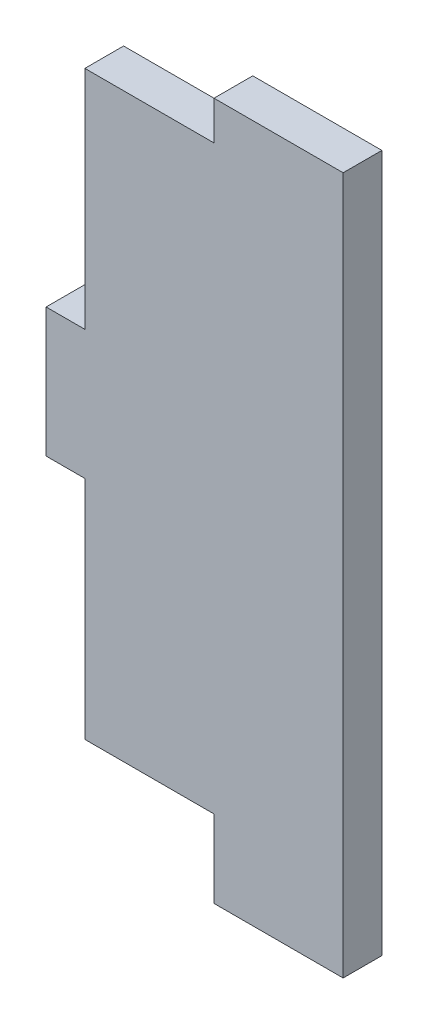
ISO-10303-21;
HEADER;
FILE_DESCRIPTION(('STEP AP214'),'2;1');
FILE_NAME('part.step','',(''),(''),'','','');
FILE_SCHEMA(('AUTOMOTIVE_DESIGN { 1 0 10303 214 1 1 1 1 }'));
ENDSEC;
DATA;
#1=APPLICATION_CONTEXT('core data for automotive mechanical design processes');
#2=APPLICATION_PROTOCOL_DEFINITION('international standard','automotive_design',2000,#1);
#3=PRODUCT_CONTEXT('',#1,'mechanical');
#4=PRODUCT('Part','Part','',(#3));
#5=PRODUCT_RELATED_PRODUCT_CATEGORY('part','',(#4));
#6=PRODUCT_DEFINITION_FORMATION('','',#4);
#7=PRODUCT_DEFINITION_CONTEXT('part definition',#1,'design');
#8=PRODUCT_DEFINITION('design','',#6,#7);
#9=PRODUCT_DEFINITION_SHAPE('','',#8);
#10=(LENGTH_UNIT() NAMED_UNIT(*) SI_UNIT(.MILLI.,.METRE.));
#11=(NAMED_UNIT(*) PLANE_ANGLE_UNIT() SI_UNIT($,.RADIAN.));
#12=(NAMED_UNIT(*) SI_UNIT($,.STERADIAN.) SOLID_ANGLE_UNIT());
#13=UNCERTAINTY_MEASURE_WITH_UNIT(LENGTH_MEASURE(1.E-05),#10,'distance_accuracy_value','');
#14=(GEOMETRIC_REPRESENTATION_CONTEXT(3) GLOBAL_UNCERTAINTY_ASSIGNED_CONTEXT((#13)) GLOBAL_UNIT_ASSIGNED_CONTEXT((#10,
#11,#12)) REPRESENTATION_CONTEXT('',''));
#15=CARTESIAN_POINT('',(0.,0.,0.));
#16=DIRECTION('',(0.,0.,1.));
#17=DIRECTION('',(1.,0.,0.));
#18=AXIS2_PLACEMENT_3D('',#15,#16,#17);
#19=CARTESIAN_POINT('',(0.,17.5,3.));
#20=DIRECTION('',(1.,0.,0.));
#21=DIRECTION('',(0.,0.,-1.));
#22=AXIS2_PLACEMENT_3D('',#19,#20,#21);
#23=PLANE('',#22);
#24=DIRECTION('',(0.,-1.,0.));
#25=VECTOR('',#24,1.);
#26=CARTESIAN_POINT('',(0.,17.5,0.));
#27=LINE('',#26,#25);
#28=CARTESIAN_POINT('',(0.,17.5,0.));
#29=VERTEX_POINT('',#28);
#30=CARTESIAN_POINT('',(0.,0.,0.));
#31=VERTEX_POINT('',#30);
#32=EDGE_CURVE('E153',#29,#31,#27,.T.);
#33=ORIENTED_EDGE('',*,*,#32,.T.);
#34=DIRECTION('',(0.,0.,-1.));
#35=VECTOR('',#34,1.);
#36=CARTESIAN_POINT('',(0.,0.,3.));
#37=LINE('',#36,#35);
#38=CARTESIAN_POINT('',(0.,0.,3.));
#39=VERTEX_POINT('',#38);
#40=EDGE_CURVE('E11',#39,#31,#37,.T.);
#41=ORIENTED_EDGE('',*,*,#40,.F.);
#42=DIRECTION('',(0.,-1.,0.));
#43=VECTOR('',#42,1.);
#44=CARTESIAN_POINT('',(0.,17.5,3.));
#45=LINE('',#44,#43);
#46=CARTESIAN_POINT('',(0.,17.5,3.));
#47=VERTEX_POINT('',#46);
#48=EDGE_CURVE('E175',#47,#39,#45,.T.);
#49=ORIENTED_EDGE('',*,*,#48,.F.);
#50=DIRECTION('',(0.,0.,-1.));
#51=VECTOR('',#50,1.);
#52=CARTESIAN_POINT('',(0.,17.5,3.));
#53=LINE('',#52,#51);
#54=EDGE_CURVE('E149',#47,#29,#53,.T.);
#55=ORIENTED_EDGE('',*,*,#54,.T.);
#56=EDGE_LOOP('',(#33,#41,#49,#55));
#57=FACE_BOUND('',#56,.T.);
#58=ADVANCED_FACE('F33',(#57),#23,.F.);
#59=CARTESIAN_POINT('',(0.,0.,3.));
#60=DIRECTION('',(0.,1.,0.));
#61=DIRECTION('',(0.,0.,1.));
#62=AXIS2_PLACEMENT_3D('',#59,#60,#61);
#63=PLANE('',#62);
#64=DIRECTION('',(1.,0.,0.));
#65=VECTOR('',#64,1.);
#66=CARTESIAN_POINT('',(0.,0.,0.));
#67=LINE('',#66,#65);
#68=CARTESIAN_POINT('',(10.,0.,0.));
#69=VERTEX_POINT('',#68);
#70=EDGE_CURVE('E156',#31,#69,#67,.T.);
#71=ORIENTED_EDGE('',*,*,#70,.T.);
#72=DIRECTION('',(0.,0.,-1.));
#73=VECTOR('',#72,1.);
#74=CARTESIAN_POINT('',(10.,0.,3.));
#75=LINE('',#74,#73);
#76=CARTESIAN_POINT('',(10.,0.,3.));
#77=VERTEX_POINT('',#76);
#78=EDGE_CURVE('E41',#77,#69,#75,.T.);
#79=ORIENTED_EDGE('',*,*,#78,.F.);
#80=DIRECTION('',(1.,0.,0.));
#81=VECTOR('',#80,1.);
#82=CARTESIAN_POINT('',(0.,0.,3.));
#83=LINE('',#82,#81);
#84=EDGE_CURVE('E104',#39,#77,#83,.T.);
#85=ORIENTED_EDGE('',*,*,#84,.F.);
#86=ORIENTED_EDGE('',*,*,#40,.T.);
#87=EDGE_LOOP('',(#71,#79,#85,#86));
#88=FACE_BOUND('',#87,.T.);
#89=ADVANCED_FACE('F253',(#88),#63,.F.);
#90=CARTESIAN_POINT('',(10.,0.,3.));
#91=DIRECTION('',(1.,0.,0.));
#92=DIRECTION('',(0.,1.,0.));
#93=AXIS2_PLACEMENT_3D('',#90,#91,#92);
#94=PLANE('',#93);
#95=DIRECTION('',(0.,-1.,0.));
#96=VECTOR('',#95,1.);
#97=CARTESIAN_POINT('',(10.,0.,0.));
#98=LINE('',#97,#96);
#99=CARTESIAN_POINT('',(10.,-6.,0.));
#100=VERTEX_POINT('',#99);
#101=EDGE_CURVE('E158',#69,#100,#98,.T.);
#102=ORIENTED_EDGE('',*,*,#101,.T.);
#103=DIRECTION('',(0.,0.,-1.));
#104=VECTOR('',#103,1.);
#105=CARTESIAN_POINT('',(10.,-6.,3.));
#106=LINE('',#105,#104);
#107=CARTESIAN_POINT('',(10.,-6.,3.));
#108=VERTEX_POINT('',#107);
#109=EDGE_CURVE('E194',#108,#100,#106,.T.);
#110=ORIENTED_EDGE('',*,*,#109,.F.);
#111=DIRECTION('',(0.,-1.,0.));
#112=VECTOR('',#111,1.);
#113=CARTESIAN_POINT('',(10.,0.,3.));
#114=LINE('',#113,#112);
#115=EDGE_CURVE('E202',#77,#108,#114,.T.);
#116=ORIENTED_EDGE('',*,*,#115,.F.);
#117=ORIENTED_EDGE('',*,*,#78,.T.);
#118=EDGE_LOOP('',(#102,#110,#116,#117));
#119=FACE_BOUND('',#118,.T.);
#120=ADVANCED_FACE('F200',(#119),#94,.F.);
#121=CARTESIAN_POINT('',(10.,-6.,3.));
#122=DIRECTION('',(0.,1.,0.));
#123=DIRECTION('',(0.,0.,1.));
#124=AXIS2_PLACEMENT_3D('',#121,#122,#123);
#125=PLANE('',#124);
#126=DIRECTION('',(1.,0.,0.));
#127=VECTOR('',#126,1.);
#128=CARTESIAN_POINT('',(10.,-6.,0.));
#129=LINE('',#128,#127);
#130=CARTESIAN_POINT('',(20.,-6.,0.));
#131=VERTEX_POINT('',#130);
#132=EDGE_CURVE('E160',#100,#131,#129,.T.);
#133=ORIENTED_EDGE('',*,*,#132,.T.);
#134=DIRECTION('',(0.,0.,-1.));
#135=VECTOR('',#134,1.);
#136=CARTESIAN_POINT('',(20.,-6.,3.));
#137=LINE('',#136,#135);
#138=CARTESIAN_POINT('',(20.,-6.,3.));
#139=VERTEX_POINT('',#138);
#140=EDGE_CURVE('E191',#139,#131,#137,.T.);
#141=ORIENTED_EDGE('',*,*,#140,.F.);
#142=DIRECTION('',(1.,0.,0.));
#143=VECTOR('',#142,1.);
#144=CARTESIAN_POINT('',(10.,-6.,3.));
#145=LINE('',#144,#143);
#146=EDGE_CURVE('E220',#108,#139,#145,.T.);
#147=ORIENTED_EDGE('',*,*,#146,.F.);
#148=ORIENTED_EDGE('',*,*,#109,.T.);
#149=EDGE_LOOP('',(#133,#141,#147,#148));
#150=FACE_BOUND('',#149,.T.);
#151=ADVANCED_FACE('F211',(#150),#125,.F.);
#152=CARTESIAN_POINT('',(20.,-6.,3.));
#153=DIRECTION('',(-1.,0.,0.));
#154=DIRECTION('',(0.,0.,1.));
#155=AXIS2_PLACEMENT_3D('',#152,#153,#154);
#156=PLANE('',#155);
#157=DIRECTION('',(0.,1.,0.));
#158=VECTOR('',#157,1.);
#159=CARTESIAN_POINT('',(20.,-6.,0.));
#160=LINE('',#159,#158);
#161=CARTESIAN_POINT('',(20.,48.,0.));
#162=VERTEX_POINT('',#161);
#163=EDGE_CURVE('E162',#131,#162,#160,.T.);
#164=ORIENTED_EDGE('',*,*,#163,.T.);
#165=DIRECTION('',(0.,0.,-1.));
#166=VECTOR('',#165,1.);
#167=CARTESIAN_POINT('',(20.,48.,3.));
#168=LINE('',#167,#166);
#169=CARTESIAN_POINT('',(20.,48.,3.));
#170=VERTEX_POINT('',#169);
#171=EDGE_CURVE('E188',#170,#162,#168,.T.);
#172=ORIENTED_EDGE('',*,*,#171,.F.);
#173=DIRECTION('',(0.,1.,0.));
#174=VECTOR('',#173,1.);
#175=CARTESIAN_POINT('',(20.,-6.,3.));
#176=LINE('',#175,#174);
#177=EDGE_CURVE('E217',#139,#170,#176,.T.);
#178=ORIENTED_EDGE('',*,*,#177,.F.);
#179=ORIENTED_EDGE('',*,*,#140,.T.);
#180=EDGE_LOOP('',(#164,#172,#178,#179));
#181=FACE_BOUND('',#180,.T.);
#182=ADVANCED_FACE('F215',(#181),#156,.F.);
#183=CARTESIAN_POINT('',(20.,48.,3.));
#184=DIRECTION('',(0.,-1.,0.));
#185=DIRECTION('',(1.,0.,0.));
#186=AXIS2_PLACEMENT_3D('',#183,#184,#185);
#187=PLANE('',#186);
#188=DIRECTION('',(-1.,0.,0.));
#189=VECTOR('',#188,1.);
#190=CARTESIAN_POINT('',(20.,48.,0.));
#191=LINE('',#190,#189);
#192=CARTESIAN_POINT('',(10.,48.,0.));
#193=VERTEX_POINT('',#192);
#194=EDGE_CURVE('E164',#162,#193,#191,.T.);
#195=ORIENTED_EDGE('',*,*,#194,.T.);
#196=DIRECTION('',(0.,0.,-1.));
#197=VECTOR('',#196,1.);
#198=CARTESIAN_POINT('',(10.,48.,3.));
#199=LINE('',#198,#197);
#200=CARTESIAN_POINT('',(10.,48.,3.));
#201=VERTEX_POINT('',#200);
#202=EDGE_CURVE('E185',#201,#193,#199,.T.);
#203=ORIENTED_EDGE('',*,*,#202,.F.);
#204=DIRECTION('',(-1.,0.,0.));
#205=VECTOR('',#204,1.);
#206=CARTESIAN_POINT('',(20.,48.,3.));
#207=LINE('',#206,#205);
#208=EDGE_CURVE('E219',#170,#201,#207,.T.);
#209=ORIENTED_EDGE('',*,*,#208,.F.);
#210=ORIENTED_EDGE('',*,*,#171,.T.);
#211=EDGE_LOOP('',(#195,#203,#209,#210));
#212=FACE_BOUND('',#211,.T.);
#213=ADVANCED_FACE('F266',(#212),#187,.F.);
#214=CARTESIAN_POINT('',(10.,48.,3.));
#215=DIRECTION('',(1.,0.,0.));
#216=DIRECTION('',(0.,0.,-1.));
#217=AXIS2_PLACEMENT_3D('',#214,#215,#216);
#218=PLANE('',#217);
#219=DIRECTION('',(0.,-1.,0.));
#220=VECTOR('',#219,1.);
#221=CARTESIAN_POINT('',(10.,48.,0.));
#222=LINE('',#221,#220);
#223=CARTESIAN_POINT('',(10.,45.,0.));
#224=VERTEX_POINT('',#223);
#225=EDGE_CURVE('E166',#193,#224,#222,.T.);
#226=ORIENTED_EDGE('',*,*,#225,.T.);
#227=DIRECTION('',(0.,0.,-1.));
#228=VECTOR('',#227,1.);
#229=CARTESIAN_POINT('',(10.,45.,3.));
#230=LINE('',#229,#228);
#231=CARTESIAN_POINT('',(10.,45.,3.));
#232=VERTEX_POINT('',#231);
#233=EDGE_CURVE('E182',#232,#224,#230,.T.);
#234=ORIENTED_EDGE('',*,*,#233,.F.);
#235=DIRECTION('',(0.,-1.,0.));
#236=VECTOR('',#235,1.);
#237=CARTESIAN_POINT('',(10.,48.,3.));
#238=LINE('',#237,#236);
#239=EDGE_CURVE('E222',#201,#232,#238,.T.);
#240=ORIENTED_EDGE('',*,*,#239,.F.);
#241=ORIENTED_EDGE('',*,*,#202,.T.);
#242=EDGE_LOOP('',(#226,#234,#240,#241));
#243=FACE_BOUND('',#242,.T.);
#244=ADVANCED_FACE('F269',(#243),#218,.F.);
#245=CARTESIAN_POINT('',(10.,45.,3.));
#246=DIRECTION('',(0.,-1.,0.));
#247=DIRECTION('',(0.,0.,-1.));
#248=AXIS2_PLACEMENT_3D('',#245,#246,#247);
#249=PLANE('',#248);
#250=DIRECTION('',(-1.,0.,0.));
#251=VECTOR('',#250,1.);
#252=CARTESIAN_POINT('',(10.,45.,0.));
#253=LINE('',#252,#251);
#254=CARTESIAN_POINT('',(0.,45.,0.));
#255=VERTEX_POINT('',#254);
#256=EDGE_CURVE('E168',#224,#255,#253,.T.);
#257=ORIENTED_EDGE('',*,*,#256,.T.);
#258=DIRECTION('',(0.,0.,-1.));
#259=VECTOR('',#258,1.);
#260=CARTESIAN_POINT('',(0.,45.,3.));
#261=LINE('',#260,#259);
#262=CARTESIAN_POINT('',(0.,45.,3.));
#263=VERTEX_POINT('',#262);
#264=EDGE_CURVE('E179',#263,#255,#261,.T.);
#265=ORIENTED_EDGE('',*,*,#264,.F.);
#266=DIRECTION('',(-1.,0.,0.));
#267=VECTOR('',#266,1.);
#268=CARTESIAN_POINT('',(10.,45.,3.));
#269=LINE('',#268,#267);
#270=EDGE_CURVE('E228',#232,#263,#269,.T.);
#271=ORIENTED_EDGE('',*,*,#270,.F.);
#272=ORIENTED_EDGE('',*,*,#233,.T.);
#273=EDGE_LOOP('',(#257,#265,#271,#272));
#274=FACE_BOUND('',#273,.T.);
#275=ADVANCED_FACE('F234',(#274),#249,.F.);
#276=CARTESIAN_POINT('',(0.,45.,3.));
#277=DIRECTION('',(1.,0.,0.));
#278=DIRECTION('',(0.,0.,-1.));
#279=AXIS2_PLACEMENT_3D('',#276,#277,#278);
#280=PLANE('',#279);
#281=DIRECTION('',(0.,-1.,0.));
#282=VECTOR('',#281,1.);
#283=CARTESIAN_POINT('',(0.,45.,0.));
#284=LINE('',#283,#282);
#285=CARTESIAN_POINT('',(0.,27.5,0.));
#286=VERTEX_POINT('',#285);
#287=EDGE_CURVE('E170',#255,#286,#284,.T.);
#288=ORIENTED_EDGE('',*,*,#287,.T.);
#289=DIRECTION('',(0.,0.,-1.));
#290=VECTOR('',#289,1.);
#291=CARTESIAN_POINT('',(0.,27.5,3.));
#292=LINE('',#291,#290);
#293=CARTESIAN_POINT('',(0.,27.5,3.));
#294=VERTEX_POINT('',#293);
#295=EDGE_CURVE('E144',#294,#286,#292,.T.);
#296=ORIENTED_EDGE('',*,*,#295,.F.);
#297=DIRECTION('',(0.,-1.,0.));
#298=VECTOR('',#297,1.);
#299=CARTESIAN_POINT('',(0.,45.,3.));
#300=LINE('',#299,#298);
#301=EDGE_CURVE('E135',#263,#294,#300,.T.);
#302=ORIENTED_EDGE('',*,*,#301,.F.);
#303=ORIENTED_EDGE('',*,*,#264,.T.);
#304=EDGE_LOOP('',(#288,#296,#302,#303));
#305=FACE_BOUND('',#304,.T.);
#306=ADVANCED_FACE('F238',(#305),#280,.F.);
#307=CARTESIAN_POINT('',(0.,27.5,3.));
#308=DIRECTION('',(0.,-1.,0.));
#309=DIRECTION('',(0.,0.,-1.));
#310=AXIS2_PLACEMENT_3D('',#307,#308,#309);
#311=PLANE('',#310);
#312=DIRECTION('',(-1.,0.,0.));
#313=VECTOR('',#312,1.);
#314=CARTESIAN_POINT('',(0.,27.5,0.));
#315=LINE('',#314,#313);
#316=CARTESIAN_POINT('',(-3.,27.5,0.));
#317=VERTEX_POINT('',#316);
#318=EDGE_CURVE('E143',#286,#317,#315,.T.);
#319=ORIENTED_EDGE('',*,*,#318,.T.);
#320=DIRECTION('',(0.,0.,-1.));
#321=VECTOR('',#320,1.);
#322=CARTESIAN_POINT('',(-3.,27.5,3.));
#323=LINE('',#322,#321);
#324=CARTESIAN_POINT('',(-3.,27.5,3.));
#325=VERTEX_POINT('',#324);
#326=EDGE_CURVE('E140',#325,#317,#323,.T.);
#327=ORIENTED_EDGE('',*,*,#326,.F.);
#328=DIRECTION('',(-1.,0.,0.));
#329=VECTOR('',#328,1.);
#330=CARTESIAN_POINT('',(0.,27.5,3.));
#331=LINE('',#330,#329);
#332=EDGE_CURVE('E129',#294,#325,#331,.T.);
#333=ORIENTED_EDGE('',*,*,#332,.F.);
#334=ORIENTED_EDGE('',*,*,#295,.T.);
#335=EDGE_LOOP('',(#319,#327,#333,#334));
#336=FACE_BOUND('',#335,.T.);
#337=ADVANCED_FACE('F141',(#336),#311,.F.);
#338=CARTESIAN_POINT('',(-3.,27.5,3.));
#339=DIRECTION('',(1.,0.,0.));
#340=DIRECTION('',(0.,0.,-1.));
#341=AXIS2_PLACEMENT_3D('',#338,#339,#340);
#342=PLANE('',#341);
#343=DIRECTION('',(0.,-1.,0.));
#344=VECTOR('',#343,1.);
#345=CARTESIAN_POINT('',(-3.,27.5,0.));
#346=LINE('',#345,#344);
#347=CARTESIAN_POINT('',(-3.,17.5,0.));
#348=VERTEX_POINT('',#347);
#349=EDGE_CURVE('E90',#317,#348,#346,.T.);
#350=ORIENTED_EDGE('',*,*,#349,.T.);
#351=DIRECTION('',(0.,0.,-1.));
#352=VECTOR('',#351,1.);
#353=CARTESIAN_POINT('',(-3.,17.5,3.));
#354=LINE('',#353,#352);
#355=CARTESIAN_POINT('',(-3.,17.5,3.));
#356=VERTEX_POINT('',#355);
#357=EDGE_CURVE('E145',#356,#348,#354,.T.);
#358=ORIENTED_EDGE('',*,*,#357,.F.);
#359=DIRECTION('',(0.,-1.,0.));
#360=VECTOR('',#359,1.);
#361=CARTESIAN_POINT('',(-3.,27.5,3.));
#362=LINE('',#361,#360);
#363=EDGE_CURVE('E133',#325,#356,#362,.T.);
#364=ORIENTED_EDGE('',*,*,#363,.F.);
#365=ORIENTED_EDGE('',*,*,#326,.T.);
#366=EDGE_LOOP('',(#350,#358,#364,#365));
#367=FACE_BOUND('',#366,.T.);
#368=ADVANCED_FACE('F147',(#367),#342,.F.);
#369=CARTESIAN_POINT('',(0.,17.5,3.));
#370=DIRECTION('',(0.,1.,0.));
#371=DIRECTION('',(-1.,0.,0.));
#372=AXIS2_PLACEMENT_3D('',#369,#370,#371);
#373=PLANE('',#372);
#374=DIRECTION('',(1.,0.,0.));
#375=VECTOR('',#374,1.);
#376=CARTESIAN_POINT('',(0.,17.5,0.));
#377=LINE('',#376,#375);
#378=EDGE_CURVE('E96',#348,#29,#377,.T.);
#379=ORIENTED_EDGE('',*,*,#378,.T.);
#380=ORIENTED_EDGE('',*,*,#54,.F.);
#381=DIRECTION('',(1.,0.,0.));
#382=VECTOR('',#381,1.);
#383=CARTESIAN_POINT('',(0.,17.5,3.));
#384=LINE('',#383,#382);
#385=EDGE_CURVE('E49',#356,#47,#384,.T.);
#386=ORIENTED_EDGE('',*,*,#385,.F.);
#387=ORIENTED_EDGE('',*,*,#357,.T.);
#388=EDGE_LOOP('',(#379,#380,#386,#387));
#389=FACE_BOUND('',#388,.T.);
#390=ADVANCED_FACE('F242',(#389),#373,.F.);
#391=CARTESIAN_POINT('',(0.,0.,3.));
#392=DIRECTION('',(0.,0.,1.));
#393=DIRECTION('',(1.,0.,0.));
#394=AXIS2_PLACEMENT_3D('',#391,#392,#393);
#395=PLANE('',#394);
#396=ORIENTED_EDGE('',*,*,#48,.T.);
#397=ORIENTED_EDGE('',*,*,#84,.T.);
#398=ORIENTED_EDGE('',*,*,#115,.T.);
#399=ORIENTED_EDGE('',*,*,#146,.T.);
#400=ORIENTED_EDGE('',*,*,#177,.T.);
#401=ORIENTED_EDGE('',*,*,#208,.T.);
#402=ORIENTED_EDGE('',*,*,#239,.T.);
#403=ORIENTED_EDGE('',*,*,#270,.T.);
#404=ORIENTED_EDGE('',*,*,#301,.T.);
#405=ORIENTED_EDGE('',*,*,#332,.T.);
#406=ORIENTED_EDGE('',*,*,#363,.T.);
#407=ORIENTED_EDGE('',*,*,#385,.T.);
#408=EDGE_LOOP('',(#396,#397,#398,#399,#400,#401,#402,#403,#404,#405,#406,#407));
#409=FACE_BOUND('',#408,.T.);
#410=ADVANCED_FACE('F131',(#409),#395,.T.);
#411=CARTESIAN_POINT('',(0.,0.,0.));
#412=DIRECTION('',(0.,0.,1.));
#413=DIRECTION('',(1.,0.,0.));
#414=AXIS2_PLACEMENT_3D('',#411,#412,#413);
#415=PLANE('',#414);
#416=ORIENTED_EDGE('',*,*,#32,.F.);
#417=ORIENTED_EDGE('',*,*,#378,.F.);
#418=ORIENTED_EDGE('',*,*,#349,.F.);
#419=ORIENTED_EDGE('',*,*,#318,.F.);
#420=ORIENTED_EDGE('',*,*,#287,.F.);
#421=ORIENTED_EDGE('',*,*,#256,.F.);
#422=ORIENTED_EDGE('',*,*,#225,.F.);
#423=ORIENTED_EDGE('',*,*,#194,.F.);
#424=ORIENTED_EDGE('',*,*,#163,.F.);
#425=ORIENTED_EDGE('',*,*,#132,.F.);
#426=ORIENTED_EDGE('',*,*,#101,.F.);
#427=ORIENTED_EDGE('',*,*,#70,.F.);
#428=EDGE_LOOP('',(#416,#417,#418,#419,#420,#421,#422,#423,#424,#425,#426,#427));
#429=FACE_BOUND('',#428,.T.);
#430=ADVANCED_FACE('F206',(#429),#415,.F.);
#431=CLOSED_SHELL('',(#58,#89,#120,#151,#182,#213,#244,#275,#306,#337,#368,#390,#410,#430));
#432=MANIFOLD_SOLID_BREP('B2',#431);
#433=ADVANCED_BREP_SHAPE_REPRESENTATION('',(#18,#432),#14);
#434=SHAPE_DEFINITION_REPRESENTATION(#9,#433);
ENDSEC;
END-ISO-10303-21;
